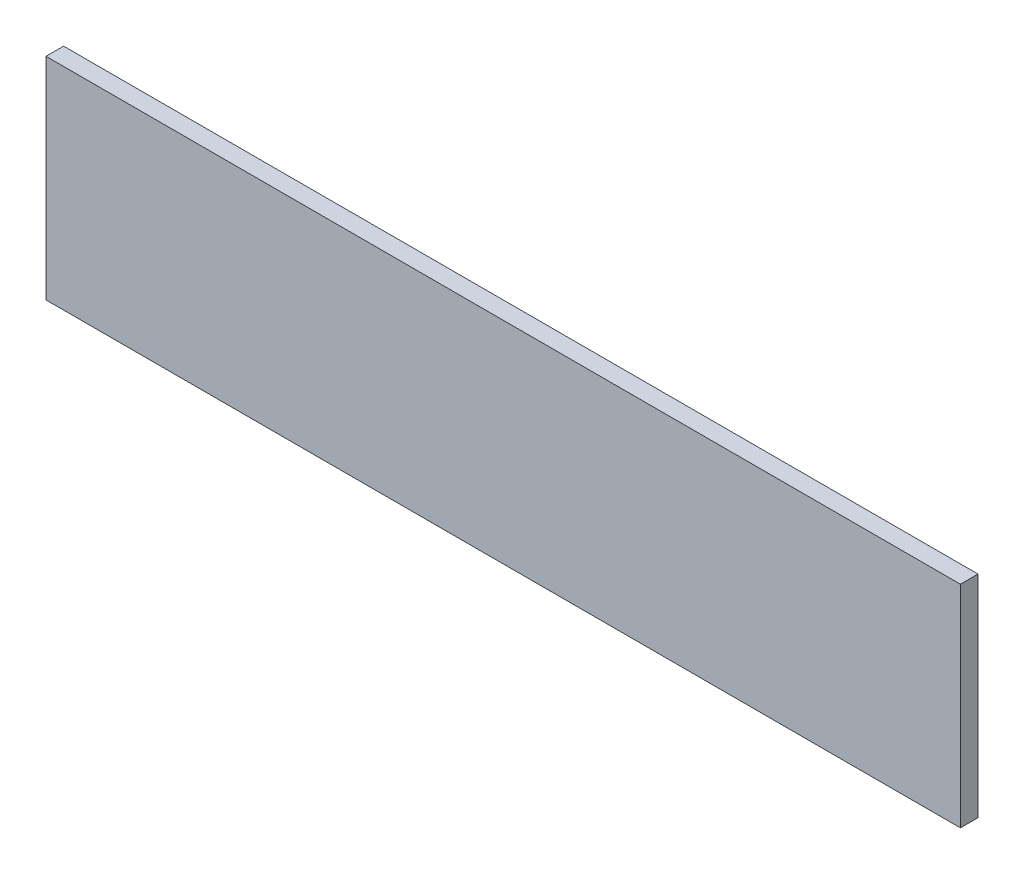
ISO-10303-21;
HEADER;
FILE_DESCRIPTION(('STEP AP214'),'2;1');
FILE_NAME('part.step','',(''),(''),'','','');
FILE_SCHEMA(('AUTOMOTIVE_DESIGN { 1 0 10303 214 1 1 1 1 }'));
ENDSEC;
DATA;
#1=APPLICATION_CONTEXT('core data for automotive mechanical design processes');
#2=APPLICATION_PROTOCOL_DEFINITION('international standard','automotive_design',2000,#1);
#3=PRODUCT_CONTEXT('',#1,'mechanical');
#4=PRODUCT('Part','Part','',(#3));
#5=PRODUCT_RELATED_PRODUCT_CATEGORY('part','',(#4));
#6=PRODUCT_DEFINITION_FORMATION('','',#4);
#7=PRODUCT_DEFINITION_CONTEXT('part definition',#1,'design');
#8=PRODUCT_DEFINITION('design','',#6,#7);
#9=PRODUCT_DEFINITION_SHAPE('','',#8);
#10=(LENGTH_UNIT() NAMED_UNIT(*) SI_UNIT(.MILLI.,.METRE.));
#11=(NAMED_UNIT(*) PLANE_ANGLE_UNIT() SI_UNIT($,.RADIAN.));
#12=(NAMED_UNIT(*) SI_UNIT($,.STERADIAN.) SOLID_ANGLE_UNIT());
#13=UNCERTAINTY_MEASURE_WITH_UNIT(LENGTH_MEASURE(1.E-05),#10,'distance_accuracy_value','');
#14=(GEOMETRIC_REPRESENTATION_CONTEXT(3) GLOBAL_UNCERTAINTY_ASSIGNED_CONTEXT((#13)) GLOBAL_UNIT_ASSIGNED_CONTEXT((#10,
#11,#12)) REPRESENTATION_CONTEXT('',''));
#15=CARTESIAN_POINT('',(0.,0.,0.));
#16=DIRECTION('',(0.,0.,1.));
#17=DIRECTION('',(1.,0.,0.));
#18=AXIS2_PLACEMENT_3D('',#15,#16,#17);
#19=CARTESIAN_POINT('',(0.,0.,6.35));
#20=DIRECTION('',(1.,0.,0.));
#21=DIRECTION('',(0.,0.,-1.));
#22=AXIS2_PLACEMENT_3D('',#19,#20,#21);
#23=PLANE('',#22);
#24=DIRECTION('',(0.,-1.,0.));
#25=VECTOR('',#24,1.);
#26=CARTESIAN_POINT('',(0.,0.,0.));
#27=LINE('',#26,#25);
#28=CARTESIAN_POINT('',(0.,76.2,0.));
#29=VERTEX_POINT('',#28);
#30=CARTESIAN_POINT('',(0.,0.,0.));
#31=VERTEX_POINT('',#30);
#32=EDGE_CURVE('E96',#29,#31,#27,.T.);
#33=ORIENTED_EDGE('',*,*,#32,.T.);
#34=DIRECTION('',(0.,0.,-1.));
#35=VECTOR('',#34,1.);
#36=CARTESIAN_POINT('',(0.,0.,6.35));
#37=LINE('',#36,#35);
#38=CARTESIAN_POINT('',(0.,0.,6.35));
#39=VERTEX_POINT('',#38);
#40=EDGE_CURVE('E11',#39,#31,#37,.T.);
#41=ORIENTED_EDGE('',*,*,#40,.F.);
#42=DIRECTION('',(0.,-1.,0.));
#43=VECTOR('',#42,1.);
#44=CARTESIAN_POINT('',(0.,0.,6.35));
#45=LINE('',#44,#43);
#46=CARTESIAN_POINT('',(0.,76.2,6.35));
#47=VERTEX_POINT('',#46);
#48=EDGE_CURVE('E84',#47,#39,#45,.T.);
#49=ORIENTED_EDGE('',*,*,#48,.F.);
#50=DIRECTION('',(0.,0.,-1.));
#51=VECTOR('',#50,1.);
#52=CARTESIAN_POINT('',(0.,76.2,6.35));
#53=LINE('',#52,#51);
#54=EDGE_CURVE('E92',#47,#29,#53,.T.);
#55=ORIENTED_EDGE('',*,*,#54,.T.);
#56=EDGE_LOOP('',(#33,#41,#49,#55));
#57=FACE_BOUND('',#56,.T.);
#58=ADVANCED_FACE('F33',(#57),#23,.F.);
#59=CARTESIAN_POINT('',(0.,0.,6.35));
#60=DIRECTION('',(0.,1.,0.));
#61=DIRECTION('',(0.,0.,1.));
#62=AXIS2_PLACEMENT_3D('',#59,#60,#61);
#63=PLANE('',#62);
#64=DIRECTION('',(1.,0.,0.));
#65=VECTOR('',#64,1.);
#66=CARTESIAN_POINT('',(0.,0.,0.));
#67=LINE('',#66,#65);
#68=CARTESIAN_POINT('',(330.2,0.,0.));
#69=VERTEX_POINT('',#68);
#70=EDGE_CURVE('E88',#31,#69,#67,.T.);
#71=ORIENTED_EDGE('',*,*,#70,.T.);
#72=DIRECTION('',(0.,0.,-1.));
#73=VECTOR('',#72,1.);
#74=CARTESIAN_POINT('',(330.2,0.,6.35));
#75=LINE('',#74,#73);
#76=CARTESIAN_POINT('',(330.2,0.,6.35));
#77=VERTEX_POINT('',#76);
#78=EDGE_CURVE('E41',#77,#69,#75,.T.);
#79=ORIENTED_EDGE('',*,*,#78,.F.);
#80=DIRECTION('',(1.,0.,0.));
#81=VECTOR('',#80,1.);
#82=CARTESIAN_POINT('',(0.,0.,6.35));
#83=LINE('',#82,#81);
#84=EDGE_CURVE('E79',#39,#77,#83,.T.);
#85=ORIENTED_EDGE('',*,*,#84,.F.);
#86=ORIENTED_EDGE('',*,*,#40,.T.);
#87=EDGE_LOOP('',(#71,#79,#85,#86));
#88=FACE_BOUND('',#87,.T.);
#89=ADVANCED_FACE('F87',(#88),#63,.F.);
#90=CARTESIAN_POINT('',(330.2,0.,6.35));
#91=DIRECTION('',(-1.,0.,0.));
#92=DIRECTION('',(0.,0.,1.));
#93=AXIS2_PLACEMENT_3D('',#90,#91,#92);
#94=PLANE('',#93);
#95=DIRECTION('',(0.,1.,0.));
#96=VECTOR('',#95,1.);
#97=CARTESIAN_POINT('',(330.2,0.,0.));
#98=LINE('',#97,#96);
#99=CARTESIAN_POINT('',(330.2,76.2,0.));
#100=VERTEX_POINT('',#99);
#101=EDGE_CURVE('E66',#69,#100,#98,.T.);
#102=ORIENTED_EDGE('',*,*,#101,.T.);
#103=DIRECTION('',(0.,0.,-1.));
#104=VECTOR('',#103,1.);
#105=CARTESIAN_POINT('',(330.2,76.2,6.35));
#106=LINE('',#105,#104);
#107=CARTESIAN_POINT('',(330.2,76.2,6.35));
#108=VERTEX_POINT('',#107);
#109=EDGE_CURVE('E89',#108,#100,#106,.T.);
#110=ORIENTED_EDGE('',*,*,#109,.F.);
#111=DIRECTION('',(0.,1.,0.));
#112=VECTOR('',#111,1.);
#113=CARTESIAN_POINT('',(330.2,0.,6.35));
#114=LINE('',#113,#112);
#115=EDGE_CURVE('E82',#77,#108,#114,.T.);
#116=ORIENTED_EDGE('',*,*,#115,.F.);
#117=ORIENTED_EDGE('',*,*,#78,.T.);
#118=EDGE_LOOP('',(#102,#110,#116,#117));
#119=FACE_BOUND('',#118,.T.);
#120=ADVANCED_FACE('F90',(#119),#94,.F.);
#121=CARTESIAN_POINT('',(0.,76.2,6.35));
#122=DIRECTION('',(0.,-1.,0.));
#123=DIRECTION('',(0.,0.,-1.));
#124=AXIS2_PLACEMENT_3D('',#121,#122,#123);
#125=PLANE('',#124);
#126=DIRECTION('',(-1.,0.,0.));
#127=VECTOR('',#126,1.);
#128=CARTESIAN_POINT('',(0.,76.2,0.));
#129=LINE('',#128,#127);
#130=EDGE_CURVE('E72',#100,#29,#129,.T.);
#131=ORIENTED_EDGE('',*,*,#130,.T.);
#132=ORIENTED_EDGE('',*,*,#54,.F.);
#133=DIRECTION('',(-1.,0.,0.));
#134=VECTOR('',#133,1.);
#135=CARTESIAN_POINT('',(0.,76.2,6.35));
#136=LINE('',#135,#134);
#137=EDGE_CURVE('E49',#108,#47,#136,.T.);
#138=ORIENTED_EDGE('',*,*,#137,.F.);
#139=ORIENTED_EDGE('',*,*,#109,.T.);
#140=EDGE_LOOP('',(#131,#132,#138,#139));
#141=FACE_BOUND('',#140,.T.);
#142=ADVANCED_FACE('F103',(#141),#125,.F.);
#143=CARTESIAN_POINT('',(0.,0.,6.35));
#144=DIRECTION('',(0.,0.,-1.));
#145=DIRECTION('',(-1.,0.,0.));
#146=AXIS2_PLACEMENT_3D('',#143,#144,#145);
#147=PLANE('',#146);
#148=ORIENTED_EDGE('',*,*,#48,.T.);
#149=ORIENTED_EDGE('',*,*,#84,.T.);
#150=ORIENTED_EDGE('',*,*,#115,.T.);
#151=ORIENTED_EDGE('',*,*,#137,.T.);
#152=EDGE_LOOP('',(#148,#149,#150,#151));
#153=FACE_BOUND('',#152,.T.);
#154=ADVANCED_FACE('F80',(#153),#147,.F.);
#155=CARTESIAN_POINT('',(0.,0.,0.));
#156=DIRECTION('',(0.,0.,-1.));
#157=DIRECTION('',(-1.,0.,0.));
#158=AXIS2_PLACEMENT_3D('',#155,#156,#157);
#159=PLANE('',#158);
#160=ORIENTED_EDGE('',*,*,#32,.F.);
#161=ORIENTED_EDGE('',*,*,#130,.F.);
#162=ORIENTED_EDGE('',*,*,#101,.F.);
#163=ORIENTED_EDGE('',*,*,#70,.F.);
#164=EDGE_LOOP('',(#160,#161,#162,#163));
#165=FACE_BOUND('',#164,.T.);
#166=ADVANCED_FACE('F106',(#165),#159,.T.);
#167=CLOSED_SHELL('',(#58,#89,#120,#142,#154,#166));
#168=MANIFOLD_SOLID_BREP('B2',#167);
#169=ADVANCED_BREP_SHAPE_REPRESENTATION('',(#18,#168),#14);
#170=SHAPE_DEFINITION_REPRESENTATION(#9,#169);
ENDSEC;
END-ISO-10303-21;
